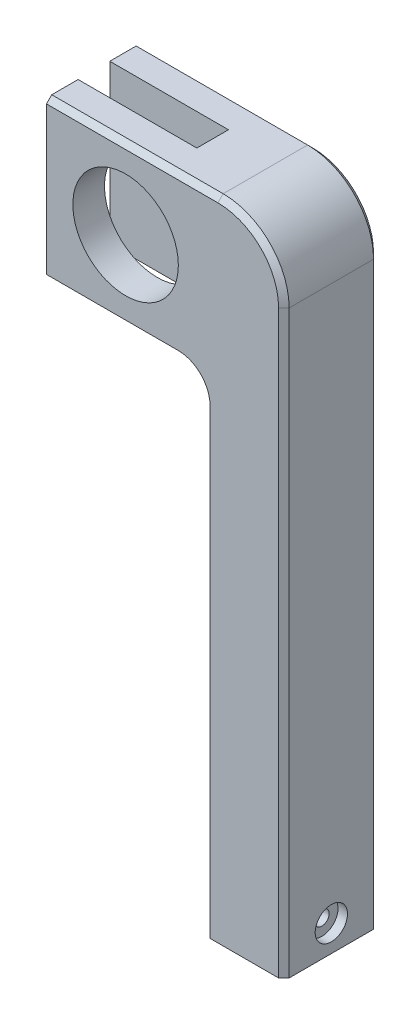
ISO-10303-21;
HEADER;
FILE_DESCRIPTION(('STEP AP214'),'2;1');
FILE_NAME('part.step','',(''),(''),'','','');
FILE_SCHEMA(('AUTOMOTIVE_DESIGN { 1 0 10303 214 1 1 1 1 }'));
ENDSEC;
DATA;
#1=APPLICATION_CONTEXT('core data for automotive mechanical design processes');
#2=APPLICATION_PROTOCOL_DEFINITION('international standard','automotive_design',2000,#1);
#3=PRODUCT_CONTEXT('',#1,'mechanical');
#4=PRODUCT('Part','Part','',(#3));
#5=PRODUCT_RELATED_PRODUCT_CATEGORY('part','',(#4));
#6=PRODUCT_DEFINITION_FORMATION('','',#4);
#7=PRODUCT_DEFINITION_CONTEXT('part definition',#1,'design');
#8=PRODUCT_DEFINITION('design','',#6,#7);
#9=PRODUCT_DEFINITION_SHAPE('','',#8);
#10=(LENGTH_UNIT() NAMED_UNIT(*) SI_UNIT(.MILLI.,.METRE.));
#11=(NAMED_UNIT(*) PLANE_ANGLE_UNIT() SI_UNIT($,.RADIAN.));
#12=(NAMED_UNIT(*) SI_UNIT($,.STERADIAN.) SOLID_ANGLE_UNIT());
#13=UNCERTAINTY_MEASURE_WITH_UNIT(LENGTH_MEASURE(1.E-05),#10,'distance_accuracy_value','');
#14=(GEOMETRIC_REPRESENTATION_CONTEXT(3) GLOBAL_UNCERTAINTY_ASSIGNED_CONTEXT((#13)) GLOBAL_UNIT_ASSIGNED_CONTEXT((#10,
#11,#12)) REPRESENTATION_CONTEXT('',''));
#15=CARTESIAN_POINT('',(0.,0.,0.));
#16=DIRECTION('',(0.,0.,1.));
#17=DIRECTION('',(1.,0.,0.));
#18=AXIS2_PLACEMENT_3D('',#15,#16,#17);
#19=CARTESIAN_POINT('',(-45.,-0.001000000000001,5.99999999999999));
#20=DIRECTION('',(0.,0.,1.));
#21=DIRECTION('',(1.,0.,0.));
#22=AXIS2_PLACEMENT_3D('',#19,#20,#21);
#23=PLANE('',#22);
#24=CARTESIAN_POINT('',(-60.,215.,5.99999999999999));
#25=DIRECTION('',(0.,0.,1.));
#26=DIRECTION('',(1.,0.,0.));
#27=AXIS2_PLACEMENT_3D('',#24,#25,#26);
#28=CIRCLE('',#27,20.);
#29=CARTESIAN_POINT('',(-45.,201.771243444677,5.99999999999999));
#30=VERTEX_POINT('',#29);
#31=CARTESIAN_POINT('',(-45.,228.228756555323,5.99999999999999));
#32=VERTEX_POINT('',#31);
#33=EDGE_CURVE('E257',#30,#32,#28,.F.);
#34=ORIENTED_EDGE('',*,*,#33,.F.);
#35=DIRECTION('',(0.,1.,0.));
#36=VECTOR('',#35,1.);
#37=CARTESIAN_POINT('',(-45.,-0.001000000000001,5.99999999999999));
#38=LINE('',#37,#36);
#39=CARTESIAN_POINT('',(-45.,185.,5.99999999999999));
#40=VERTEX_POINT('',#39);
#41=EDGE_CURVE('E283',#40,#30,#38,.T.);
#42=ORIENTED_EDGE('',*,*,#41,.F.);
#43=DIRECTION('',(1.,0.,0.));
#44=VECTOR('',#43,1.);
#45=CARTESIAN_POINT('',(-45.,185.,5.99999999999999));
#46=LINE('',#45,#44);
#47=CARTESIAN_POINT('',(-90.,185.,6.));
#48=VERTEX_POINT('',#47);
#49=EDGE_CURVE('E276',#48,#40,#46,.T.);
#50=ORIENTED_EDGE('',*,*,#49,.F.);
#51=DIRECTION('',(0.,1.,0.));
#52=VECTOR('',#51,1.);
#53=CARTESIAN_POINT('',(-90.,-0.001000000000001,6.));
#54=LINE('',#53,#52);
#55=CARTESIAN_POINT('',(-90.,245.,6.));
#56=VERTEX_POINT('',#55);
#57=EDGE_CURVE('E278',#48,#56,#54,.T.);
#58=ORIENTED_EDGE('',*,*,#57,.T.);
#59=DIRECTION('',(1.,0.,0.));
#60=VECTOR('',#59,1.);
#61=CARTESIAN_POINT('',(-45.,245.,5.99999999999999));
#62=LINE('',#61,#60);
#63=CARTESIAN_POINT('',(-45.,245.,5.99999999999999));
#64=VERTEX_POINT('',#63);
#65=EDGE_CURVE('E270',#56,#64,#62,.T.);
#66=ORIENTED_EDGE('',*,*,#65,.T.);
#67=EDGE_CURVE('E290',#32,#64,#38,.T.);
#68=ORIENTED_EDGE('',*,*,#67,.F.);
#69=EDGE_LOOP('',(#34,#42,#50,#58,#66,#68));
#70=FACE_BOUND('',#69,.T.);
#71=ADVANCED_FACE('F44',(#70),#23,.F.);
#72=CARTESIAN_POINT('',(-90.,185.,-18.));
#73=DIRECTION('',(-1.,0.,0.));
#74=DIRECTION('',(0.,0.,1.));
#75=AXIS2_PLACEMENT_3D('',#72,#73,#74);
#76=PLANE('',#75);
#77=CARTESIAN_POINT('',(-90.,190.,-12.));
#78=DIRECTION('',(-1.,0.,0.));
#79=DIRECTION('',(0.,0.,1.));
#80=AXIS2_PLACEMENT_3D('',#77,#78,#79);
#81=CIRCLE('',#80,1.5);
#82=CARTESIAN_POINT('',(-90.,190.,-10.5));
#83=VERTEX_POINT('',#82);
#84=EDGE_CURVE('E213',#83,#83,#81,.T.);
#85=ORIENTED_EDGE('',*,*,#84,.F.);
#86=EDGE_LOOP('',(#85));
#87=FACE_BOUND('',#86,.T.);
#88=CARTESIAN_POINT('',(-90.,240.,-12.));
#89=DIRECTION('',(-1.,0.,0.));
#90=DIRECTION('',(0.,0.,1.));
#91=AXIS2_PLACEMENT_3D('',#88,#89,#90);
#92=CIRCLE('',#91,1.5);
#93=CARTESIAN_POINT('',(-90.,240.,-10.5));
#94=VERTEX_POINT('',#93);
#95=EDGE_CURVE('E225',#94,#94,#92,.T.);
#96=ORIENTED_EDGE('',*,*,#95,.F.);
#97=EDGE_LOOP('',(#96));
#98=FACE_BOUND('',#97,.T.);
#99=DIRECTION('',(0.,-1.,0.));
#100=VECTOR('',#99,1.);
#101=CARTESIAN_POINT('',(-90.,185.,-18.));
#102=LINE('',#101,#100);
#103=CARTESIAN_POINT('',(-90.,243.,-18.));
#104=VERTEX_POINT('',#103);
#105=CARTESIAN_POINT('',(-90.,187.,-18.));
#106=VERTEX_POINT('',#105);
#107=EDGE_CURVE('E292',#104,#106,#102,.T.);
#108=ORIENTED_EDGE('',*,*,#107,.T.);
#109=DIRECTION('',(0.,0.707106781186543,-0.707106781186552));
#110=VECTOR('',#109,1.);
#111=CARTESIAN_POINT('',(-90.,186.,-17.));
#112=LINE('',#111,#110);
#113=CARTESIAN_POINT('',(-90.,185.,-16.));
#114=VERTEX_POINT('',#113);
#115=EDGE_CURVE('E378',#106,#114,#112,.F.);
#116=ORIENTED_EDGE('',*,*,#115,.T.);
#117=DIRECTION('',(0.,0.,1.));
#118=VECTOR('',#117,1.);
#119=CARTESIAN_POINT('',(-90.,185.,-18.));
#120=LINE('',#119,#118);
#121=CARTESIAN_POINT('',(-90.,185.,-6.));
#122=VERTEX_POINT('',#121);
#123=EDGE_CURVE('E311',#114,#122,#120,.T.);
#124=ORIENTED_EDGE('',*,*,#123,.T.);
#125=DIRECTION('',(0.,1.,0.));
#126=VECTOR('',#125,1.);
#127=CARTESIAN_POINT('',(-90.,-0.001000000000001,-6.));
#128=LINE('',#127,#126);
#129=CARTESIAN_POINT('',(-90.,245.,-6.));
#130=VERTEX_POINT('',#129);
#131=EDGE_CURVE('E279',#122,#130,#128,.T.);
#132=ORIENTED_EDGE('',*,*,#131,.T.);
#133=DIRECTION('',(0.,0.,1.));
#134=VECTOR('',#133,1.);
#135=CARTESIAN_POINT('',(-90.,245.,-18.));
#136=LINE('',#135,#134);
#137=CARTESIAN_POINT('',(-90.,245.,-16.));
#138=VERTEX_POINT('',#137);
#139=EDGE_CURVE('E313',#138,#130,#136,.T.);
#140=ORIENTED_EDGE('',*,*,#139,.F.);
#141=DIRECTION('',(0.,0.707106781186543,0.707106781186552));
#142=VECTOR('',#141,1.);
#143=CARTESIAN_POINT('',(-90.,214.,-47.));
#144=LINE('',#143,#142);
#145=EDGE_CURVE('E380',#138,#104,#144,.F.);
#146=ORIENTED_EDGE('',*,*,#145,.T.);
#147=EDGE_LOOP('',(#108,#116,#124,#132,#140,#146));
#148=FACE_BOUND('',#147,.T.);
#149=ADVANCED_FACE('F497',(#87,#98,#148),#76,.T.);
#150=CARTESIAN_POINT('',(-30.,185.,-18.));
#151=DIRECTION('',(0.,-1.,0.));
#152=DIRECTION('',(0.,0.,-1.));
#153=AXIS2_PLACEMENT_3D('',#150,#151,#152);
#154=PLANE('',#153);
#155=DIRECTION('',(0.,0.,1.));
#156=VECTOR('',#155,1.);
#157=CARTESIAN_POINT('',(-40.,185.,18.));
#158=LINE('',#157,#156);
#159=CARTESIAN_POINT('',(-40.,185.,-16.));
#160=VERTEX_POINT('',#159);
#161=CARTESIAN_POINT('',(-40.,185.,16.));
#162=VERTEX_POINT('',#161);
#163=EDGE_CURVE('E318',#160,#162,#158,.T.);
#164=ORIENTED_EDGE('',*,*,#163,.T.);
#165=DIRECTION('',(-1.,0.,0.));
#166=VECTOR('',#165,1.);
#167=CARTESIAN_POINT('',(-90.,185.,16.));
#168=LINE('',#167,#166);
#169=CARTESIAN_POINT('',(-90.,185.,16.));
#170=VERTEX_POINT('',#169);
#171=EDGE_CURVE('E342',#162,#170,#168,.T.);
#172=ORIENTED_EDGE('',*,*,#171,.T.);
#173=EDGE_CURVE('E312',#48,#170,#120,.T.);
#174=ORIENTED_EDGE('',*,*,#173,.F.);
#175=ORIENTED_EDGE('',*,*,#49,.T.);
#176=DIRECTION('',(0.,0.,-1.));
#177=VECTOR('',#176,1.);
#178=CARTESIAN_POINT('',(-45.,185.,5.99999999999999));
#179=LINE('',#178,#177);
#180=CARTESIAN_POINT('',(-45.,185.,-5.99999999999999));
#181=VERTEX_POINT('',#180);
#182=EDGE_CURVE('E262',#40,#181,#179,.T.);
#183=ORIENTED_EDGE('',*,*,#182,.T.);
#184=DIRECTION('',(-1.,0.,0.));
#185=VECTOR('',#184,1.);
#186=CARTESIAN_POINT('',(-45.,185.,-5.99999999999999));
#187=LINE('',#186,#185);
#188=EDGE_CURVE('E264',#181,#122,#187,.T.);
#189=ORIENTED_EDGE('',*,*,#188,.T.);
#190=ORIENTED_EDGE('',*,*,#123,.F.);
#191=DIRECTION('',(1.,0.,0.));
#192=VECTOR('',#191,1.);
#193=CARTESIAN_POINT('',(-30.,185.,-16.));
#194=LINE('',#193,#192);
#195=EDGE_CURVE('E338',#114,#160,#194,.T.);
#196=ORIENTED_EDGE('',*,*,#195,.T.);
#197=EDGE_LOOP('',(#164,#172,#174,#175,#183,#189,#190,#196));
#198=FACE_BOUND('',#197,.T.);
#199=ADVANCED_FACE('F473',(#198),#154,.T.);
#200=CARTESIAN_POINT('',(0.,245.,-18.));
#201=DIRECTION('',(1.,0.,0.));
#202=DIRECTION('',(0.,1.,0.));
#203=AXIS2_PLACEMENT_3D('',#200,#201,#202);
#204=PLANE('',#203);
#205=CARTESIAN_POINT('',(0.,10.,0.));
#206=DIRECTION('',(1.,0.,0.));
#207=DIRECTION('',(0.,0.,-1.));
#208=AXIS2_PLACEMENT_3D('',#205,#206,#207);
#209=CIRCLE('',#208,6.12);
#210=CARTESIAN_POINT('',(0.,10.,-6.12));
#211=VERTEX_POINT('',#210);
#212=EDGE_CURVE('E234',#211,#211,#209,.T.);
#213=ORIENTED_EDGE('',*,*,#212,.F.);
#214=EDGE_LOOP('',(#213));
#215=FACE_BOUND('',#214,.T.);
#216=DIRECTION('',(0.,0.,1.));
#217=VECTOR('',#216,1.);
#218=CARTESIAN_POINT('',(0.,0.,-18.));
#219=LINE('',#218,#217);
#220=CARTESIAN_POINT('',(0.,0.,-16.));
#221=VERTEX_POINT('',#220);
#222=CARTESIAN_POINT('',(0.,0.,16.));
#223=VERTEX_POINT('',#222);
#224=EDGE_CURVE('E302',#221,#223,#219,.T.);
#225=ORIENTED_EDGE('',*,*,#224,.F.);
#226=DIRECTION('',(0.,1.,0.));
#227=VECTOR('',#226,1.);
#228=CARTESIAN_POINT('',(0.,245.,-16.));
#229=LINE('',#228,#227);
#230=CARTESIAN_POINT('',(0.,220.,-16.));
#231=VERTEX_POINT('',#230);
#232=EDGE_CURVE('E11',#221,#231,#229,.T.);
#233=ORIENTED_EDGE('',*,*,#232,.T.);
#234=DIRECTION('',(0.,0.,1.));
#235=VECTOR('',#234,1.);
#236=CARTESIAN_POINT('',(0.,220.,-18.));
#237=LINE('',#236,#235);
#238=CARTESIAN_POINT('',(0.,220.,16.));
#239=VERTEX_POINT('',#238);
#240=EDGE_CURVE('E310',#231,#239,#237,.T.);
#241=ORIENTED_EDGE('',*,*,#240,.T.);
#242=DIRECTION('',(0.,-1.,0.));
#243=VECTOR('',#242,1.);
#244=CARTESIAN_POINT('',(0.,0.,16.));
#245=LINE('',#244,#243);
#246=EDGE_CURVE('E54',#239,#223,#245,.T.);
#247=ORIENTED_EDGE('',*,*,#246,.T.);
#248=EDGE_LOOP('',(#225,#233,#241,#247));
#249=FACE_BOUND('',#248,.T.);
#250=ADVANCED_FACE('F418',(#215,#249),#204,.T.);
#251=CARTESIAN_POINT('',(0.,0.,-18.));
#252=DIRECTION('',(0.,-1.,0.));
#253=DIRECTION('',(1.,0.,0.));
#254=AXIS2_PLACEMENT_3D('',#251,#252,#253);
#255=PLANE('',#254);
#256=DIRECTION('',(1.,0.,0.));
#257=VECTOR('',#256,1.);
#258=CARTESIAN_POINT('',(0.,0.,18.));
#259=LINE('',#258,#257);
#260=CARTESIAN_POINT('',(-28.,0.,18.));
#261=VERTEX_POINT('',#260);
#262=CARTESIAN_POINT('',(-2.,0.,18.));
#263=VERTEX_POINT('',#262);
#264=EDGE_CURVE('E298',#261,#263,#259,.T.);
#265=ORIENTED_EDGE('',*,*,#264,.F.);
#266=DIRECTION('',(-0.707106781186548,0.,-0.707106781186548));
#267=VECTOR('',#266,1.);
#268=CARTESIAN_POINT('',(-32.,0.,14.));
#269=LINE('',#268,#267);
#270=CARTESIAN_POINT('',(-30.,0.,16.));
#271=VERTEX_POINT('',#270);
#272=EDGE_CURVE('E360',#261,#271,#269,.T.);
#273=ORIENTED_EDGE('',*,*,#272,.T.);
#274=DIRECTION('',(0.,0.,1.));
#275=VECTOR('',#274,1.);
#276=CARTESIAN_POINT('',(-30.,0.,-18.));
#277=LINE('',#276,#275);
#278=CARTESIAN_POINT('',(-30.,0.,-16.));
#279=VERTEX_POINT('',#278);
#280=EDGE_CURVE('E308',#279,#271,#277,.T.);
#281=ORIENTED_EDGE('',*,*,#280,.F.);
#282=DIRECTION('',(-0.707106781186543,0.,0.707106781186552));
#283=VECTOR('',#282,1.);
#284=CARTESIAN_POINT('',(-14.0000000000002,0.,-32.));
#285=LINE('',#284,#283);
#286=CARTESIAN_POINT('',(-28.,0.,-18.));
#287=VERTEX_POINT('',#286);
#288=EDGE_CURVE('E357',#279,#287,#285,.F.);
#289=ORIENTED_EDGE('',*,*,#288,.T.);
#290=DIRECTION('',(1.,0.,0.));
#291=VECTOR('',#290,1.);
#292=CARTESIAN_POINT('',(0.,0.,-18.));
#293=LINE('',#292,#291);
#294=CARTESIAN_POINT('',(-1.99999999999997,0.,-18.));
#295=VERTEX_POINT('',#294);
#296=EDGE_CURVE('E294',#287,#295,#293,.T.);
#297=ORIENTED_EDGE('',*,*,#296,.T.);
#298=DIRECTION('',(-0.707106781186543,0.,-0.707106781186552));
#299=VECTOR('',#298,1.);
#300=CARTESIAN_POINT('',(-1.,0.,-17.));
#301=LINE('',#300,#299);
#302=EDGE_CURVE('E354',#295,#221,#301,.F.);
#303=ORIENTED_EDGE('',*,*,#302,.T.);
#304=ORIENTED_EDGE('',*,*,#224,.T.);
#305=DIRECTION('',(-0.707106781186552,0.,0.707106781186543));
#306=VECTOR('',#305,1.);
#307=CARTESIAN_POINT('',(17.,0.,-0.999999999999755));
#308=LINE('',#307,#306);
#309=EDGE_CURVE('E353',#223,#263,#308,.T.);
#310=ORIENTED_EDGE('',*,*,#309,.T.);
#311=EDGE_LOOP('',(#265,#273,#281,#289,#297,#303,#304,#310));
#312=FACE_BOUND('',#311,.T.);
#313=ADVANCED_FACE('F423',(#312),#255,.T.);
#314=CARTESIAN_POINT('',(-30.,185.,-18.));
#315=DIRECTION('',(-1.,0.,0.));
#316=DIRECTION('',(0.,-1.,0.));
#317=AXIS2_PLACEMENT_3D('',#314,#315,#316);
#318=PLANE('',#317);
#319=CARTESIAN_POINT('',(-30.,10.,0.));
#320=DIRECTION('',(-1.,0.,0.));
#321=DIRECTION('',(0.,-1.,0.));
#322=AXIS2_PLACEMENT_3D('',#319,#320,#321);
#323=CIRCLE('',#322,2.75);
#324=CARTESIAN_POINT('',(-30.,7.25,0.));
#325=VERTEX_POINT('',#324);
#326=EDGE_CURVE('E243',#325,#325,#323,.T.);
#327=ORIENTED_EDGE('',*,*,#326,.F.);
#328=EDGE_LOOP('',(#327));
#329=FACE_BOUND('',#328,.T.);
#330=ORIENTED_EDGE('',*,*,#280,.T.);
#331=DIRECTION('',(0.,1.,0.));
#332=VECTOR('',#331,1.);
#333=CARTESIAN_POINT('',(-30.,175.,16.));
#334=LINE('',#333,#332);
#335=CARTESIAN_POINT('',(-30.,175.,16.));
#336=VERTEX_POINT('',#335);
#337=EDGE_CURVE('E361',#271,#336,#334,.T.);
#338=ORIENTED_EDGE('',*,*,#337,.T.);
#339=DIRECTION('',(0.,0.,1.));
#340=VECTOR('',#339,1.);
#341=CARTESIAN_POINT('',(-30.,175.,-18.));
#342=LINE('',#341,#340);
#343=CARTESIAN_POINT('',(-30.,175.,-16.));
#344=VERTEX_POINT('',#343);
#345=EDGE_CURVE('E322',#336,#344,#342,.F.);
#346=ORIENTED_EDGE('',*,*,#345,.T.);
#347=DIRECTION('',(0.,-1.,0.));
#348=VECTOR('',#347,1.);
#349=CARTESIAN_POINT('',(-30.,185.,-16.));
#350=LINE('',#349,#348);
#351=EDGE_CURVE('E363',#344,#279,#350,.T.);
#352=ORIENTED_EDGE('',*,*,#351,.T.);
#353=EDGE_LOOP('',(#330,#338,#346,#352));
#354=FACE_BOUND('',#353,.T.);
#355=ADVANCED_FACE('F488',(#329,#354),#318,.T.);
#356=CARTESIAN_POINT('',(-90.,240.,12.));
#357=DIRECTION('',(-1.,0.,0.));
#358=DIRECTION('',(0.,0.,1.));
#359=AXIS2_PLACEMENT_3D('',#356,#357,#358);
#360=CIRCLE('',#359,1.5);
#361=CARTESIAN_POINT('',(-90.,240.,13.5));
#362=VERTEX_POINT('',#361);
#363=EDGE_CURVE('E214',#362,#362,#360,.T.);
#364=ORIENTED_EDGE('',*,*,#363,.F.);
#365=EDGE_LOOP('',(#364));
#366=FACE_BOUND('',#365,.T.);
#367=CARTESIAN_POINT('',(-90.,190.,12.));
#368=DIRECTION('',(-1.,0.,0.));
#369=DIRECTION('',(0.,0.,1.));
#370=AXIS2_PLACEMENT_3D('',#367,#368,#369);
#371=CIRCLE('',#370,1.5);
#372=CARTESIAN_POINT('',(-90.,190.,13.5));
#373=VERTEX_POINT('',#372);
#374=EDGE_CURVE('E226',#373,#373,#371,.T.);
#375=ORIENTED_EDGE('',*,*,#374,.F.);
#376=EDGE_LOOP('',(#375));
#377=FACE_BOUND('',#376,.T.);
#378=ORIENTED_EDGE('',*,*,#173,.T.);
#379=DIRECTION('',(0.,0.707106781186548,0.707106781186548));
#380=VECTOR('',#379,1.);
#381=CARTESIAN_POINT('',(-90.,168.,-1.00000000000001));
#382=LINE('',#381,#380);
#383=CARTESIAN_POINT('',(-90.,187.,18.));
#384=VERTEX_POINT('',#383);
#385=EDGE_CURVE('E350',#170,#384,#382,.T.);
#386=ORIENTED_EDGE('',*,*,#385,.T.);
#387=DIRECTION('',(0.,-1.,0.));
#388=VECTOR('',#387,1.);
#389=CARTESIAN_POINT('',(-90.,185.,18.));
#390=LINE('',#389,#388);
#391=CARTESIAN_POINT('',(-90.,243.,18.));
#392=VERTEX_POINT('',#391);
#393=EDGE_CURVE('E293',#392,#384,#390,.T.);
#394=ORIENTED_EDGE('',*,*,#393,.F.);
#395=DIRECTION('',(0.,0.707106781186552,-0.707106781186543));
#396=VECTOR('',#395,1.);
#397=CARTESIAN_POINT('',(-90.,232.,29.0000000000002));
#398=LINE('',#397,#396);
#399=CARTESIAN_POINT('',(-90.,245.,16.));
#400=VERTEX_POINT('',#399);
#401=EDGE_CURVE('E341',#392,#400,#398,.T.);
#402=ORIENTED_EDGE('',*,*,#401,.T.);
#403=EDGE_CURVE('E299',#56,#400,#136,.T.);
#404=ORIENTED_EDGE('',*,*,#403,.F.);
#405=ORIENTED_EDGE('',*,*,#57,.F.);
#406=EDGE_LOOP('',(#378,#386,#394,#402,#404,#405));
#407=FACE_BOUND('',#406,.T.);
#408=ADVANCED_FACE('F449',(#366,#377,#407),#76,.T.);
#409=CARTESIAN_POINT('',(-90.,245.,-18.));
#410=DIRECTION('',(0.,1.,0.));
#411=DIRECTION('',(0.,0.,1.));
#412=AXIS2_PLACEMENT_3D('',#409,#410,#411);
#413=PLANE('',#412);
#414=DIRECTION('',(0.,0.,1.));
#415=VECTOR('',#414,1.);
#416=CARTESIAN_POINT('',(-25.,245.,-18.));
#417=LINE('',#416,#415);
#418=CARTESIAN_POINT('',(-25.,245.,16.));
#419=VERTEX_POINT('',#418);
#420=CARTESIAN_POINT('',(-25.,245.,-16.));
#421=VERTEX_POINT('',#420);
#422=EDGE_CURVE('E320',#419,#421,#417,.F.);
#423=ORIENTED_EDGE('',*,*,#422,.T.);
#424=DIRECTION('',(-1.,0.,0.));
#425=VECTOR('',#424,1.);
#426=CARTESIAN_POINT('',(-90.,245.,-16.));
#427=LINE('',#426,#425);
#428=EDGE_CURVE('E384',#421,#138,#427,.T.);
#429=ORIENTED_EDGE('',*,*,#428,.T.);
#430=ORIENTED_EDGE('',*,*,#139,.T.);
#431=DIRECTION('',(-1.,0.,0.));
#432=VECTOR('',#431,1.);
#433=CARTESIAN_POINT('',(-45.,245.,-5.99999999999999));
#434=LINE('',#433,#432);
#435=CARTESIAN_POINT('',(-45.,245.,-5.99999999999999));
#436=VERTEX_POINT('',#435);
#437=EDGE_CURVE('E271',#436,#130,#434,.T.);
#438=ORIENTED_EDGE('',*,*,#437,.F.);
#439=DIRECTION('',(0.,0.,-1.));
#440=VECTOR('',#439,1.);
#441=CARTESIAN_POINT('',(-45.,245.,5.99999999999999));
#442=LINE('',#441,#440);
#443=EDGE_CURVE('E269',#64,#436,#442,.T.);
#444=ORIENTED_EDGE('',*,*,#443,.F.);
#445=ORIENTED_EDGE('',*,*,#65,.F.);
#446=ORIENTED_EDGE('',*,*,#403,.T.);
#447=DIRECTION('',(1.,0.,0.));
#448=VECTOR('',#447,1.);
#449=CARTESIAN_POINT('',(-25.,245.,16.));
#450=LINE('',#449,#448);
#451=EDGE_CURVE('E382',#400,#419,#450,.T.);
#452=ORIENTED_EDGE('',*,*,#451,.T.);
#453=EDGE_LOOP('',(#423,#429,#430,#438,#444,#445,#446,#452));
#454=FACE_BOUND('',#453,.T.);
#455=ADVANCED_FACE('F436',(#454),#413,.T.);
#456=CARTESIAN_POINT('',(0.,0.,-18.));
#457=DIRECTION('',(0.,0.,-1.));
#458=DIRECTION('',(-1.,0.,0.));
#459=AXIS2_PLACEMENT_3D('',#456,#457,#458);
#460=PLANE('',#459);
#461=CARTESIAN_POINT('',(-60.,215.,-18.));
#462=DIRECTION('',(0.,0.,-1.));
#463=DIRECTION('',(-1.,0.,0.));
#464=AXIS2_PLACEMENT_3D('',#461,#462,#463);
#465=CIRCLE('',#464,13.);
#466=CARTESIAN_POINT('',(-73.,215.,-18.));
#467=VERTEX_POINT('',#466);
#468=EDGE_CURVE('E250',#467,#467,#465,.T.);
#469=ORIENTED_EDGE('',*,*,#468,.F.);
#470=EDGE_LOOP('',(#469));
#471=FACE_BOUND('',#470,.T.);
#472=CARTESIAN_POINT('',(-40.,175.,-18.));
#473=DIRECTION('',(0.,0.,-1.));
#474=DIRECTION('',(-1.,0.,0.));
#475=AXIS2_PLACEMENT_3D('',#472,#473,#474);
#476=CIRCLE('',#475,12.);
#477=CARTESIAN_POINT('',(-28.,175.,-18.));
#478=VERTEX_POINT('',#477);
#479=CARTESIAN_POINT('',(-40.,187.,-18.));
#480=VERTEX_POINT('',#479);
#481=EDGE_CURVE('E373',#478,#480,#476,.F.);
#482=ORIENTED_EDGE('',*,*,#481,.T.);
#483=DIRECTION('',(-1.,0.,0.));
#484=VECTOR('',#483,1.);
#485=CARTESIAN_POINT('',(0.,187.,-18.));
#486=LINE('',#485,#484);
#487=EDGE_CURVE('E374',#480,#106,#486,.T.);
#488=ORIENTED_EDGE('',*,*,#487,.T.);
#489=ORIENTED_EDGE('',*,*,#107,.F.);
#490=DIRECTION('',(1.,0.,0.));
#491=VECTOR('',#490,1.);
#492=CARTESIAN_POINT('',(0.,243.,-18.));
#493=LINE('',#492,#491);
#494=CARTESIAN_POINT('',(-25.,243.,-18.));
#495=VERTEX_POINT('',#494);
#496=EDGE_CURVE('E367',#104,#495,#493,.T.);
#497=ORIENTED_EDGE('',*,*,#496,.T.);
#498=CARTESIAN_POINT('',(-25.,220.,-18.));
#499=DIRECTION('',(0.,0.,-1.));
#500=DIRECTION('',(-1.,0.,0.));
#501=AXIS2_PLACEMENT_3D('',#498,#499,#500);
#502=CIRCLE('',#501,23.);
#503=CARTESIAN_POINT('',(-1.99999999999998,220.,-18.));
#504=VERTEX_POINT('',#503);
#505=EDGE_CURVE('E370',#495,#504,#502,.T.);
#506=ORIENTED_EDGE('',*,*,#505,.T.);
#507=DIRECTION('',(0.,-1.,0.));
#508=VECTOR('',#507,1.);
#509=CARTESIAN_POINT('',(-1.99999999999997,0.,-18.));
#510=LINE('',#509,#508);
#511=EDGE_CURVE('E362',#504,#295,#510,.T.);
#512=ORIENTED_EDGE('',*,*,#511,.T.);
#513=ORIENTED_EDGE('',*,*,#296,.F.);
#514=DIRECTION('',(0.,1.,0.));
#515=VECTOR('',#514,1.);
#516=CARTESIAN_POINT('',(-28.,0.,-18.));
#517=LINE('',#516,#515);
#518=EDGE_CURVE('E371',#287,#478,#517,.T.);
#519=ORIENTED_EDGE('',*,*,#518,.T.);
#520=EDGE_LOOP('',(#482,#488,#489,#497,#506,#512,#513,#519));
#521=FACE_BOUND('',#520,.T.);
#522=ADVANCED_FACE('F491',(#471,#521),#460,.T.);
#523=CARTESIAN_POINT('',(0.,0.,18.));
#524=DIRECTION('',(0.,0.,-1.));
#525=DIRECTION('',(-1.,0.,0.));
#526=AXIS2_PLACEMENT_3D('',#523,#524,#525);
#527=PLANE('',#526);
#528=CARTESIAN_POINT('',(-60.,215.,18.));
#529=DIRECTION('',(0.,0.,1.));
#530=DIRECTION('',(1.,0.,0.));
#531=AXIS2_PLACEMENT_3D('',#528,#529,#530);
#532=CIRCLE('',#531,20.);
#533=CARTESIAN_POINT('',(-40.,215.,18.));
#534=VERTEX_POINT('',#533);
#535=EDGE_CURVE('E251',#534,#534,#532,.T.);
#536=ORIENTED_EDGE('',*,*,#535,.F.);
#537=EDGE_LOOP('',(#536));
#538=FACE_BOUND('',#537,.T.);
#539=ORIENTED_EDGE('',*,*,#393,.T.);
#540=DIRECTION('',(1.,0.,0.));
#541=VECTOR('',#540,1.);
#542=CARTESIAN_POINT('',(-40.,187.,18.));
#543=LINE('',#542,#541);
#544=CARTESIAN_POINT('',(-40.,187.,18.));
#545=VERTEX_POINT('',#544);
#546=EDGE_CURVE('E340',#384,#545,#543,.T.);
#547=ORIENTED_EDGE('',*,*,#546,.T.);
#548=CARTESIAN_POINT('',(-40.,175.,18.));
#549=DIRECTION('',(0.,0.,-1.));
#550=DIRECTION('',(-1.,0.,0.));
#551=AXIS2_PLACEMENT_3D('',#548,#549,#550);
#552=CIRCLE('',#551,12.);
#553=CARTESIAN_POINT('',(-28.,175.,18.));
#554=VERTEX_POINT('',#553);
#555=EDGE_CURVE('E334',#545,#554,#552,.T.);
#556=ORIENTED_EDGE('',*,*,#555,.T.);
#557=DIRECTION('',(0.,-1.,0.));
#558=VECTOR('',#557,1.);
#559=CARTESIAN_POINT('',(-28.,0.,18.));
#560=LINE('',#559,#558);
#561=EDGE_CURVE('E333',#554,#261,#560,.T.);
#562=ORIENTED_EDGE('',*,*,#561,.T.);
#563=ORIENTED_EDGE('',*,*,#264,.T.);
#564=DIRECTION('',(0.,1.,0.));
#565=VECTOR('',#564,1.);
#566=CARTESIAN_POINT('',(-2.,220.,18.));
#567=LINE('',#566,#565);
#568=CARTESIAN_POINT('',(-2.,220.,18.));
#569=VERTEX_POINT('',#568);
#570=EDGE_CURVE('E327',#263,#569,#567,.T.);
#571=ORIENTED_EDGE('',*,*,#570,.T.);
#572=CARTESIAN_POINT('',(-25.,220.,18.));
#573=DIRECTION('',(0.,0.,-1.));
#574=DIRECTION('',(-1.,0.,0.));
#575=AXIS2_PLACEMENT_3D('',#572,#573,#574);
#576=CIRCLE('',#575,23.);
#577=CARTESIAN_POINT('',(-25.,243.,18.));
#578=VERTEX_POINT('',#577);
#579=EDGE_CURVE('E328',#569,#578,#576,.F.);
#580=ORIENTED_EDGE('',*,*,#579,.T.);
#581=DIRECTION('',(-1.,0.,0.));
#582=VECTOR('',#581,1.);
#583=CARTESIAN_POINT('',(-90.,243.,18.));
#584=LINE('',#583,#582);
#585=EDGE_CURVE('E326',#578,#392,#584,.T.);
#586=ORIENTED_EDGE('',*,*,#585,.T.);
#587=EDGE_LOOP('',(#539,#547,#556,#562,#563,#571,#580,#586));
#588=FACE_BOUND('',#587,.T.);
#589=ADVANCED_FACE('F444',(#538,#588),#527,.F.);
#590=CARTESIAN_POINT('',(-45.,-0.001000000000001,-5.99999999999999));
#591=DIRECTION('',(0.,0.,-1.));
#592=DIRECTION('',(-1.,0.,0.));
#593=AXIS2_PLACEMENT_3D('',#590,#591,#592);
#594=PLANE('',#593);
#595=CARTESIAN_POINT('',(-60.,215.,-6.));
#596=DIRECTION('',(0.,0.,-1.));
#597=DIRECTION('',(-1.,0.,0.));
#598=AXIS2_PLACEMENT_3D('',#595,#596,#597);
#599=CIRCLE('',#598,13.);
#600=CARTESIAN_POINT('',(-73.,215.,-6.));
#601=VERTEX_POINT('',#600);
#602=EDGE_CURVE('E249',#601,#601,#599,.F.);
#603=ORIENTED_EDGE('',*,*,#602,.F.);
#604=EDGE_LOOP('',(#603));
#605=FACE_BOUND('',#604,.T.);
#606=DIRECTION('',(0.,1.,0.));
#607=VECTOR('',#606,1.);
#608=CARTESIAN_POINT('',(-45.,-0.001000000000001,-5.99999999999999));
#609=LINE('',#608,#607);
#610=EDGE_CURVE('E282',#181,#436,#609,.T.);
#611=ORIENTED_EDGE('',*,*,#610,.T.);
#612=ORIENTED_EDGE('',*,*,#437,.T.);
#613=ORIENTED_EDGE('',*,*,#131,.F.);
#614=ORIENTED_EDGE('',*,*,#188,.F.);
#615=EDGE_LOOP('',(#611,#612,#613,#614));
#616=FACE_BOUND('',#615,.T.);
#617=ADVANCED_FACE('F502',(#605,#616),#594,.F.);
#618=CARTESIAN_POINT('',(-45.,-0.001000000000001,5.99999999999999));
#619=DIRECTION('',(1.,0.,0.));
#620=DIRECTION('',(0.,0.,-1.));
#621=AXIS2_PLACEMENT_3D('',#618,#619,#620);
#622=PLANE('',#621);
#623=ORIENTED_EDGE('',*,*,#41,.T.);
#624=EDGE_CURVE('E286',#30,#32,#38,.T.);
#625=ORIENTED_EDGE('',*,*,#624,.T.);
#626=ORIENTED_EDGE('',*,*,#67,.T.);
#627=ORIENTED_EDGE('',*,*,#443,.T.);
#628=ORIENTED_EDGE('',*,*,#610,.F.);
#629=ORIENTED_EDGE('',*,*,#182,.F.);
#630=EDGE_LOOP('',(#623,#625,#626,#627,#628,#629));
#631=FACE_BOUND('',#630,.T.);
#632=ADVANCED_FACE('F510',(#631),#622,.F.);
#633=CARTESIAN_POINT('',(-25.,220.,-18.));
#634=DIRECTION('',(0.,0.,1.));
#635=DIRECTION('',(1.,0.,0.));
#636=AXIS2_PLACEMENT_3D('',#633,#634,#635);
#637=CYLINDRICAL_SURFACE('',#636,25.);
#638=ORIENTED_EDGE('',*,*,#240,.F.);
#639=CARTESIAN_POINT('',(-25.,220.,-16.));
#640=DIRECTION('',(0.,0.,-1.));
#641=DIRECTION('',(-1.,0.,0.));
#642=AXIS2_PLACEMENT_3D('',#639,#640,#641);
#643=CIRCLE('',#642,25.);
#644=EDGE_CURVE('E389',#231,#421,#643,.F.);
#645=ORIENTED_EDGE('',*,*,#644,.T.);
#646=ORIENTED_EDGE('',*,*,#422,.F.);
#647=CARTESIAN_POINT('',(-25.,220.,16.));
#648=DIRECTION('',(0.,0.,-1.));
#649=DIRECTION('',(-1.,0.,0.));
#650=AXIS2_PLACEMENT_3D('',#647,#648,#649);
#651=CIRCLE('',#650,25.);
#652=EDGE_CURVE('E62',#419,#239,#651,.T.);
#653=ORIENTED_EDGE('',*,*,#652,.T.);
#654=EDGE_LOOP('',(#638,#645,#646,#653));
#655=FACE_BOUND('',#654,.T.);
#656=ADVANCED_FACE('F432',(#655),#637,.T.);
#657=CARTESIAN_POINT('',(-40.,175.,-18.));
#658=DIRECTION('',(0.,0.,-1.));
#659=DIRECTION('',(-1.,0.,0.));
#660=AXIS2_PLACEMENT_3D('',#657,#658,#659);
#661=CYLINDRICAL_SURFACE('',#660,10.);
#662=ORIENTED_EDGE('',*,*,#345,.F.);
#663=CARTESIAN_POINT('',(-40.,175.,16.));
#664=DIRECTION('',(0.,0.,-1.));
#665=DIRECTION('',(-1.,0.,0.));
#666=AXIS2_PLACEMENT_3D('',#663,#664,#665);
#667=CIRCLE('',#666,10.);
#668=EDGE_CURVE('E351',#336,#162,#667,.F.);
#669=ORIENTED_EDGE('',*,*,#668,.T.);
#670=ORIENTED_EDGE('',*,*,#163,.F.);
#671=CARTESIAN_POINT('',(-40.,175.,-16.));
#672=DIRECTION('',(0.,0.,-1.));
#673=DIRECTION('',(-1.,0.,0.));
#674=AXIS2_PLACEMENT_3D('',#671,#672,#673);
#675=CIRCLE('',#674,10.);
#676=EDGE_CURVE('E349',#160,#344,#675,.T.);
#677=ORIENTED_EDGE('',*,*,#676,.T.);
#678=EDGE_LOOP('',(#662,#669,#670,#677));
#679=FACE_BOUND('',#678,.T.);
#680=ADVANCED_FACE('F469',(#679),#661,.F.);
#681=CARTESIAN_POINT('',(-60.,215.,-50.5685424949238));
#682=DIRECTION('',(0.,0.,1.));
#683=DIRECTION('',(1.,0.,0.));
#684=AXIS2_PLACEMENT_3D('',#681,#682,#683);
#685=CYLINDRICAL_SURFACE('',#684,20.);
#686=ORIENTED_EDGE('',*,*,#33,.T.);
#687=EDGE_CURVE('E259',#32,#30,#28,.F.);
#688=ORIENTED_EDGE('',*,*,#687,.T.);
#689=EDGE_LOOP('',(#686,#688));
#690=FACE_BOUND('',#689,.T.);
#691=ORIENTED_EDGE('',*,*,#535,.T.);
#692=EDGE_LOOP('',(#691));
#693=FACE_BOUND('',#692,.T.);
#694=ADVANCED_FACE('F519',(#690,#693),#685,.F.);
#695=CARTESIAN_POINT('',(-45.,-0.001000000000001,5.99999999999999));
#696=DIRECTION('',(0.,0.,1.));
#697=DIRECTION('',(1.,0.,0.));
#698=AXIS2_PLACEMENT_3D('',#695,#696,#697);
#699=PLANE('',#698);
#700=ORIENTED_EDGE('',*,*,#687,.F.);
#701=ORIENTED_EDGE('',*,*,#624,.F.);
#702=EDGE_LOOP('',(#700,#701));
#703=FACE_BOUND('',#702,.T.);
#704=ADVANCED_FACE('F513',(#703),#699,.T.);
#705=CARTESIAN_POINT('',(-60.,215.,18.001));
#706=DIRECTION('',(0.,0.,-1.));
#707=DIRECTION('',(-1.,0.,0.));
#708=AXIS2_PLACEMENT_3D('',#705,#706,#707);
#709=CYLINDRICAL_SURFACE('',#708,13.);
#710=ORIENTED_EDGE('',*,*,#468,.T.);
#711=EDGE_LOOP('',(#710));
#712=FACE_BOUND('',#711,.T.);
#713=ORIENTED_EDGE('',*,*,#602,.T.);
#714=EDGE_LOOP('',(#713));
#715=FACE_BOUND('',#714,.T.);
#716=ADVANCED_FACE('F550',(#712,#715),#709,.F.);
#717=CARTESIAN_POINT('',(-28.,0.,18.));
#718=DIRECTION('',(-0.707106781186547,0.,0.707106781186547));
#719=DIRECTION('',(0.,1.,0.));
#720=AXIS2_PLACEMENT_3D('',#717,#718,#719);
#721=PLANE('',#720);
#722=ORIENTED_EDGE('',*,*,#272,.F.);
#723=ORIENTED_EDGE('',*,*,#561,.F.);
#724=DIRECTION('',(0.707106781186547,0.,0.707106781186547));
#725=VECTOR('',#724,1.);
#726=CARTESIAN_POINT('',(-30.,175.,16.));
#727=LINE('',#726,#725);
#728=EDGE_CURVE('E252',#336,#554,#727,.T.);
#729=ORIENTED_EDGE('',*,*,#728,.F.);
#730=ORIENTED_EDGE('',*,*,#337,.F.);
#731=EDGE_LOOP('',(#722,#723,#729,#730));
#732=FACE_BOUND('',#731,.T.);
#733=ADVANCED_FACE('F465',(#732),#721,.T.);
#734=CARTESIAN_POINT('',(-40.,175.,18.));
#735=DIRECTION('',(0.,0.,1.));
#736=DIRECTION('',(1.,0.,0.));
#737=AXIS2_PLACEMENT_3D('',#734,#735,#736);
#738=CONICAL_SURFACE('',#737,12.,0.78539816339745);
#739=ORIENTED_EDGE('',*,*,#728,.T.);
#740=ORIENTED_EDGE('',*,*,#555,.F.);
#741=DIRECTION('',(0.,0.707106781186547,0.707106781186547));
#742=VECTOR('',#741,1.);
#743=CARTESIAN_POINT('',(-40.,185.,16.));
#744=LINE('',#743,#742);
#745=EDGE_CURVE('E386',#162,#545,#744,.T.);
#746=ORIENTED_EDGE('',*,*,#745,.F.);
#747=ORIENTED_EDGE('',*,*,#668,.F.);
#748=EDGE_LOOP('',(#739,#740,#746,#747));
#749=FACE_BOUND('',#748,.T.);
#750=ADVANCED_FACE('F464',(#749),#738,.F.);
#751=CARTESIAN_POINT('',(0.,187.,18.));
#752=DIRECTION('',(0.,-0.707106781186547,0.707106781186547));
#753=DIRECTION('',(-1.,0.,0.));
#754=AXIS2_PLACEMENT_3D('',#751,#752,#753);
#755=PLANE('',#754);
#756=ORIENTED_EDGE('',*,*,#385,.F.);
#757=ORIENTED_EDGE('',*,*,#171,.F.);
#758=ORIENTED_EDGE('',*,*,#745,.T.);
#759=ORIENTED_EDGE('',*,*,#546,.F.);
#760=EDGE_LOOP('',(#756,#757,#758,#759));
#761=FACE_BOUND('',#760,.T.);
#762=ADVANCED_FACE('F455',(#761),#755,.T.);
#763=CARTESIAN_POINT('',(-30.,185.,-16.));
#764=DIRECTION('',(0.707106781186552,0.,0.707106781186543));
#765=DIRECTION('',(0.,-1.,0.));
#766=AXIS2_PLACEMENT_3D('',#763,#764,#765);
#767=PLANE('',#766);
#768=ORIENTED_EDGE('',*,*,#288,.F.);
#769=ORIENTED_EDGE('',*,*,#351,.F.);
#770=DIRECTION('',(-0.707106781186543,0.,0.707106781186552));
#771=VECTOR('',#770,1.);
#772=CARTESIAN_POINT('',(-28.,175.,-18.));
#773=LINE('',#772,#771);
#774=EDGE_CURVE('E395',#478,#344,#773,.T.);
#775=ORIENTED_EDGE('',*,*,#774,.F.);
#776=ORIENTED_EDGE('',*,*,#518,.F.);
#777=EDGE_LOOP('',(#768,#769,#775,#776));
#778=FACE_BOUND('',#777,.T.);
#779=ADVANCED_FACE('F489',(#778),#767,.F.);
#780=CARTESIAN_POINT('',(-40.,175.,-18.));
#781=DIRECTION('',(0.,0.,-1.));
#782=DIRECTION('',(-1.,0.,0.));
#783=AXIS2_PLACEMENT_3D('',#780,#781,#782);
#784=CONICAL_SURFACE('',#783,12.,0.785398163397444);
#785=ORIENTED_EDGE('',*,*,#774,.T.);
#786=ORIENTED_EDGE('',*,*,#676,.F.);
#787=DIRECTION('',(0.,-0.707106781186543,0.707106781186552));
#788=VECTOR('',#787,1.);
#789=CARTESIAN_POINT('',(-40.,187.,-18.));
#790=LINE('',#789,#788);
#791=EDGE_CURVE('E391',#480,#160,#790,.T.);
#792=ORIENTED_EDGE('',*,*,#791,.F.);
#793=ORIENTED_EDGE('',*,*,#481,.F.);
#794=EDGE_LOOP('',(#785,#786,#792,#793));
#795=FACE_BOUND('',#794,.T.);
#796=ADVANCED_FACE('F485',(#795),#784,.F.);
#797=CARTESIAN_POINT('',(-30.,185.,-16.));
#798=DIRECTION('',(0.,0.707106781186552,0.707106781186543));
#799=DIRECTION('',(1.,0.,0.));
#800=AXIS2_PLACEMENT_3D('',#797,#798,#799);
#801=PLANE('',#800);
#802=ORIENTED_EDGE('',*,*,#115,.F.);
#803=ORIENTED_EDGE('',*,*,#487,.F.);
#804=ORIENTED_EDGE('',*,*,#791,.T.);
#805=ORIENTED_EDGE('',*,*,#195,.F.);
#806=EDGE_LOOP('',(#802,#803,#804,#805));
#807=FACE_BOUND('',#806,.T.);
#808=ADVANCED_FACE('F477',(#807),#801,.F.);
#809=CARTESIAN_POINT('',(0.,245.,-16.));
#810=DIRECTION('',(-0.707106781186552,0.,0.707106781186543));
#811=DIRECTION('',(0.,1.,0.));
#812=AXIS2_PLACEMENT_3D('',#809,#810,#811);
#813=PLANE('',#812);
#814=ORIENTED_EDGE('',*,*,#302,.F.);
#815=ORIENTED_EDGE('',*,*,#511,.F.);
#816=DIRECTION('',(-0.707106781186543,0.,-0.707106781186552));
#817=VECTOR('',#816,1.);
#818=CARTESIAN_POINT('',(0.,220.,-16.));
#819=LINE('',#818,#817);
#820=EDGE_CURVE('E400',#231,#504,#819,.T.);
#821=ORIENTED_EDGE('',*,*,#820,.F.);
#822=ORIENTED_EDGE('',*,*,#232,.F.);
#823=EDGE_LOOP('',(#814,#815,#821,#822));
#824=FACE_BOUND('',#823,.T.);
#825=ADVANCED_FACE('F428',(#824),#813,.F.);
#826=CARTESIAN_POINT('',(-25.,220.,-18.));
#827=DIRECTION('',(0.,0.,1.));
#828=DIRECTION('',(1.,0.,0.));
#829=AXIS2_PLACEMENT_3D('',#826,#827,#828);
#830=CONICAL_SURFACE('',#829,23.,0.785398163397443);
#831=ORIENTED_EDGE('',*,*,#820,.T.);
#832=ORIENTED_EDGE('',*,*,#505,.F.);
#833=DIRECTION('',(0.,-0.707106781186543,-0.707106781186552));
#834=VECTOR('',#833,1.);
#835=CARTESIAN_POINT('',(-25.,245.,-16.));
#836=LINE('',#835,#834);
#837=EDGE_CURVE('E399',#421,#495,#836,.T.);
#838=ORIENTED_EDGE('',*,*,#837,.F.);
#839=ORIENTED_EDGE('',*,*,#644,.F.);
#840=EDGE_LOOP('',(#831,#832,#838,#839));
#841=FACE_BOUND('',#840,.T.);
#842=ADVANCED_FACE('F435',(#841),#830,.T.);
#843=CARTESIAN_POINT('',(-90.,245.,-16.));
#844=DIRECTION('',(0.,-0.707106781186552,0.707106781186543));
#845=DIRECTION('',(-1.,0.,0.));
#846=AXIS2_PLACEMENT_3D('',#843,#844,#845);
#847=PLANE('',#846);
#848=ORIENTED_EDGE('',*,*,#837,.T.);
#849=ORIENTED_EDGE('',*,*,#496,.F.);
#850=ORIENTED_EDGE('',*,*,#145,.F.);
#851=ORIENTED_EDGE('',*,*,#428,.F.);
#852=EDGE_LOOP('',(#848,#849,#850,#851));
#853=FACE_BOUND('',#852,.T.);
#854=ADVANCED_FACE('F500',(#853),#847,.F.);
#855=CARTESIAN_POINT('',(-2.,0.,18.));
#856=DIRECTION('',(0.707106781186543,0.,0.707106781186552));
#857=DIRECTION('',(0.,-1.,0.));
#858=AXIS2_PLACEMENT_3D('',#855,#856,#857);
#859=PLANE('',#858);
#860=ORIENTED_EDGE('',*,*,#309,.F.);
#861=ORIENTED_EDGE('',*,*,#246,.F.);
#862=DIRECTION('',(0.707106781186552,0.,-0.707106781186543));
#863=VECTOR('',#862,1.);
#864=CARTESIAN_POINT('',(-2.,220.,18.));
#865=LINE('',#864,#863);
#866=EDGE_CURVE('E49',#569,#239,#865,.T.);
#867=ORIENTED_EDGE('',*,*,#866,.F.);
#868=ORIENTED_EDGE('',*,*,#570,.F.);
#869=EDGE_LOOP('',(#860,#861,#867,#868));
#870=FACE_BOUND('',#869,.T.);
#871=ADVANCED_FACE('F48',(#870),#859,.T.);
#872=CARTESIAN_POINT('',(-25.,220.,18.));
#873=DIRECTION('',(0.,0.,-1.));
#874=DIRECTION('',(-1.,0.,0.));
#875=AXIS2_PLACEMENT_3D('',#872,#873,#874);
#876=CONICAL_SURFACE('',#875,23.,0.785398163397457);
#877=ORIENTED_EDGE('',*,*,#866,.T.);
#878=ORIENTED_EDGE('',*,*,#652,.F.);
#879=DIRECTION('',(0.,0.707106781186552,-0.707106781186543));
#880=VECTOR('',#879,1.);
#881=CARTESIAN_POINT('',(-25.,243.,18.));
#882=LINE('',#881,#880);
#883=EDGE_CURVE('E246',#578,#419,#882,.T.);
#884=ORIENTED_EDGE('',*,*,#883,.F.);
#885=ORIENTED_EDGE('',*,*,#579,.F.);
#886=EDGE_LOOP('',(#877,#878,#884,#885));
#887=FACE_BOUND('',#886,.T.);
#888=ADVANCED_FACE('F413',(#887),#876,.T.);
#889=CARTESIAN_POINT('',(0.,243.,18.));
#890=DIRECTION('',(0.,0.707106781186543,0.707106781186552));
#891=DIRECTION('',(1.,0.,0.));
#892=AXIS2_PLACEMENT_3D('',#889,#890,#891);
#893=PLANE('',#892);
#894=ORIENTED_EDGE('',*,*,#883,.T.);
#895=ORIENTED_EDGE('',*,*,#451,.F.);
#896=ORIENTED_EDGE('',*,*,#401,.F.);
#897=ORIENTED_EDGE('',*,*,#585,.F.);
#898=EDGE_LOOP('',(#894,#895,#896,#897));
#899=FACE_BOUND('',#898,.T.);
#900=ADVANCED_FACE('F441',(#899),#893,.T.);
#901=CARTESIAN_POINT('',(0.,10.,0.));
#902=DIRECTION('',(1.,0.,0.));
#903=DIRECTION('',(0.,0.,-1.));
#904=AXIS2_PLACEMENT_3D('',#901,#902,#903);
#905=CYLINDRICAL_SURFACE('',#904,2.75);
#906=CARTESIAN_POINT('',(-3.58,10.,0.));
#907=DIRECTION('',(1.,0.,0.));
#908=DIRECTION('',(0.,0.,-1.));
#909=AXIS2_PLACEMENT_3D('',#906,#907,#908);
#910=CIRCLE('',#909,2.75);
#911=CARTESIAN_POINT('',(-3.58,10.,-2.75));
#912=VERTEX_POINT('',#911);
#913=EDGE_CURVE('E239',#912,#912,#910,.T.);
#914=ORIENTED_EDGE('',*,*,#913,.T.);
#915=EDGE_LOOP('',(#914));
#916=FACE_BOUND('',#915,.T.);
#917=ORIENTED_EDGE('',*,*,#326,.T.);
#918=EDGE_LOOP('',(#917));
#919=FACE_BOUND('',#918,.T.);
#920=ADVANCED_FACE('F553',(#916,#919),#905,.F.);
#921=CARTESIAN_POINT('',(-3.58,12.75,0.));
#922=DIRECTION('',(-1.,0.,0.));
#923=DIRECTION('',(0.,0.,1.));
#924=AXIS2_PLACEMENT_3D('',#921,#922,#923);
#925=PLANE('',#924);
#926=ORIENTED_EDGE('',*,*,#913,.F.);
#927=EDGE_LOOP('',(#926));
#928=FACE_BOUND('',#927,.T.);
#929=CARTESIAN_POINT('',(-3.58,10.,0.));
#930=DIRECTION('',(1.,0.,0.));
#931=DIRECTION('',(0.,0.,-1.));
#932=AXIS2_PLACEMENT_3D('',#929,#930,#931);
#933=CIRCLE('',#932,6.12);
#934=CARTESIAN_POINT('',(-3.58,10.,-6.12));
#935=VERTEX_POINT('',#934);
#936=EDGE_CURVE('E240',#935,#935,#933,.T.);
#937=ORIENTED_EDGE('',*,*,#936,.T.);
#938=EDGE_LOOP('',(#937));
#939=FACE_BOUND('',#938,.T.);
#940=ADVANCED_FACE('F555',(#928,#939),#925,.F.);
#941=CARTESIAN_POINT('',(0.,10.,0.));
#942=DIRECTION('',(1.,0.,0.));
#943=DIRECTION('',(0.,0.,-1.));
#944=AXIS2_PLACEMENT_3D('',#941,#942,#943);
#945=CYLINDRICAL_SURFACE('',#944,6.12);
#946=ORIENTED_EDGE('',*,*,#936,.F.);
#947=EDGE_LOOP('',(#946));
#948=FACE_BOUND('',#947,.T.);
#949=ORIENTED_EDGE('',*,*,#212,.T.);
#950=EDGE_LOOP('',(#949));
#951=FACE_BOUND('',#950,.T.);
#952=ADVANCED_FACE('F556',(#948,#951),#945,.F.);
#953=CARTESIAN_POINT('',(-70.,190.,12.));
#954=DIRECTION('',(-1.,0.,0.));
#955=DIRECTION('',(0.,0.,1.));
#956=AXIS2_PLACEMENT_3D('',#953,#954,#955);
#957=CONICAL_SURFACE('',#956,1.5,1.02974425867666);
#958=CARTESIAN_POINT('',(-69.0987090714587,190.,12.));
#959=VERTEX_POINT('',#958);
#960=VERTEX_LOOP('',#959);
#961=FACE_BOUND('',#960,.T.);
#962=CARTESIAN_POINT('',(-70.,190.,12.));
#963=DIRECTION('',(-1.,0.,0.));
#964=DIRECTION('',(0.,0.,1.));
#965=AXIS2_PLACEMENT_3D('',#962,#963,#964);
#966=CIRCLE('',#965,1.5);
#967=CARTESIAN_POINT('',(-70.,190.,13.5));
#968=VERTEX_POINT('',#967);
#969=EDGE_CURVE('E233',#968,#968,#966,.T.);
#970=ORIENTED_EDGE('',*,*,#969,.T.);
#971=EDGE_LOOP('',(#970));
#972=FACE_BOUND('',#971,.T.);
#973=ADVANCED_FACE('F565',(#961,#972),#957,.F.);
#974=CARTESIAN_POINT('',(-90.,190.,12.));
#975=DIRECTION('',(-1.,0.,0.));
#976=DIRECTION('',(0.,0.,1.));
#977=AXIS2_PLACEMENT_3D('',#974,#975,#976);
#978=CYLINDRICAL_SURFACE('',#977,1.5);
#979=ORIENTED_EDGE('',*,*,#969,.F.);
#980=EDGE_LOOP('',(#979));
#981=FACE_BOUND('',#980,.T.);
#982=ORIENTED_EDGE('',*,*,#374,.T.);
#983=EDGE_LOOP('',(#982));
#984=FACE_BOUND('',#983,.T.);
#985=ADVANCED_FACE('F566',(#981,#984),#978,.F.);
#986=CARTESIAN_POINT('',(-70.,240.,-12.));
#987=DIRECTION('',(-1.,0.,0.));
#988=DIRECTION('',(0.,0.,1.));
#989=AXIS2_PLACEMENT_3D('',#986,#987,#988);
#990=CONICAL_SURFACE('',#989,1.5,1.02974425867666);
#991=CARTESIAN_POINT('',(-69.0987090714587,240.,-12.));
#992=VERTEX_POINT('',#991);
#993=VERTEX_LOOP('',#992);
#994=FACE_BOUND('',#993,.T.);
#995=CARTESIAN_POINT('',(-70.,240.,-12.));
#996=DIRECTION('',(-1.,0.,0.));
#997=DIRECTION('',(0.,0.,1.));
#998=AXIS2_PLACEMENT_3D('',#995,#996,#997);
#999=CIRCLE('',#998,1.5);
#1000=CARTESIAN_POINT('',(-70.,240.,-10.5));
#1001=VERTEX_POINT('',#1000);
#1002=EDGE_CURVE('E224',#1001,#1001,#999,.T.);
#1003=ORIENTED_EDGE('',*,*,#1002,.T.);
#1004=EDGE_LOOP('',(#1003));
#1005=FACE_BOUND('',#1004,.T.);
#1006=ADVANCED_FACE('F569',(#994,#1005),#990,.F.);
#1007=CARTESIAN_POINT('',(-90.,240.,-12.));
#1008=DIRECTION('',(-1.,0.,0.));
#1009=DIRECTION('',(0.,0.,1.));
#1010=AXIS2_PLACEMENT_3D('',#1007,#1008,#1009);
#1011=CYLINDRICAL_SURFACE('',#1010,1.5);
#1012=ORIENTED_EDGE('',*,*,#1002,.F.);
#1013=EDGE_LOOP('',(#1012));
#1014=FACE_BOUND('',#1013,.T.);
#1015=ORIENTED_EDGE('',*,*,#95,.T.);
#1016=EDGE_LOOP('',(#1015));
#1017=FACE_BOUND('',#1016,.T.);
#1018=ADVANCED_FACE('F573',(#1014,#1017),#1011,.F.);
#1019=CARTESIAN_POINT('',(-70.,190.,-12.));
#1020=DIRECTION('',(-1.,0.,0.));
#1021=DIRECTION('',(0.,0.,1.));
#1022=AXIS2_PLACEMENT_3D('',#1019,#1020,#1021);
#1023=CONICAL_SURFACE('',#1022,1.5,1.02974425867666);
#1024=CARTESIAN_POINT('',(-69.0987090714587,190.,-12.));
#1025=VERTEX_POINT('',#1024);
#1026=VERTEX_LOOP('',#1025);
#1027=FACE_BOUND('',#1026,.T.);
#1028=CARTESIAN_POINT('',(-70.,190.,-12.));
#1029=DIRECTION('',(-1.,0.,0.));
#1030=DIRECTION('',(0.,0.,1.));
#1031=AXIS2_PLACEMENT_3D('',#1028,#1029,#1030);
#1032=CIRCLE('',#1031,1.5);
#1033=CARTESIAN_POINT('',(-70.,190.,-10.5));
#1034=VERTEX_POINT('',#1033);
#1035=EDGE_CURVE('E211',#1034,#1034,#1032,.T.);
#1036=ORIENTED_EDGE('',*,*,#1035,.T.);
#1037=EDGE_LOOP('',(#1036));
#1038=FACE_BOUND('',#1037,.T.);
#1039=ADVANCED_FACE('F579',(#1027,#1038),#1023,.F.);
#1040=CARTESIAN_POINT('',(-90.,190.,-12.));
#1041=DIRECTION('',(-1.,0.,0.));
#1042=DIRECTION('',(0.,0.,1.));
#1043=AXIS2_PLACEMENT_3D('',#1040,#1041,#1042);
#1044=CYLINDRICAL_SURFACE('',#1043,1.5);
#1045=ORIENTED_EDGE('',*,*,#1035,.F.);
#1046=EDGE_LOOP('',(#1045));
#1047=FACE_BOUND('',#1046,.T.);
#1048=ORIENTED_EDGE('',*,*,#84,.T.);
#1049=EDGE_LOOP('',(#1048));
#1050=FACE_BOUND('',#1049,.T.);
#1051=ADVANCED_FACE('F204',(#1047,#1050),#1044,.F.);
#1052=CARTESIAN_POINT('',(-70.,240.,12.));
#1053=DIRECTION('',(-1.,0.,0.));
#1054=DIRECTION('',(0.,0.,1.));
#1055=AXIS2_PLACEMENT_3D('',#1052,#1053,#1054);
#1056=CONICAL_SURFACE('',#1055,1.5,1.02974425867666);
#1057=CARTESIAN_POINT('',(-69.0987090714587,240.,12.));
#1058=VERTEX_POINT('',#1057);
#1059=VERTEX_LOOP('',#1058);
#1060=FACE_BOUND('',#1059,.T.);
#1061=CARTESIAN_POINT('',(-70.,240.,12.));
#1062=DIRECTION('',(-1.,0.,0.));
#1063=DIRECTION('',(0.,0.,1.));
#1064=AXIS2_PLACEMENT_3D('',#1061,#1062,#1063);
#1065=CIRCLE('',#1064,1.5);
#1066=CARTESIAN_POINT('',(-70.,240.,13.5));
#1067=VERTEX_POINT('',#1066);
#1068=EDGE_CURVE('E209',#1067,#1067,#1065,.T.);
#1069=ORIENTED_EDGE('',*,*,#1068,.T.);
#1070=EDGE_LOOP('',(#1069));
#1071=FACE_BOUND('',#1070,.T.);
#1072=ADVANCED_FACE('F201',(#1060,#1071),#1056,.F.);
#1073=CARTESIAN_POINT('',(-90.,240.,12.));
#1074=DIRECTION('',(-1.,0.,0.));
#1075=DIRECTION('',(0.,0.,1.));
#1076=AXIS2_PLACEMENT_3D('',#1073,#1074,#1075);
#1077=CYLINDRICAL_SURFACE('',#1076,1.5);
#1078=ORIENTED_EDGE('',*,*,#1068,.F.);
#1079=EDGE_LOOP('',(#1078));
#1080=FACE_BOUND('',#1079,.T.);
#1081=ORIENTED_EDGE('',*,*,#363,.T.);
#1082=EDGE_LOOP('',(#1081));
#1083=FACE_BOUND('',#1082,.T.);
#1084=ADVANCED_FACE('F202',(#1080,#1083),#1077,.F.);
#1085=CLOSED_SHELL('',(#71,#149,#199,#250,#313,#355,#408,#455,#522,#589,#617,#632,#656,#680,
#694,#704,#716,#733,#750,#762,#779,#796,#808,#825,#842,#854,#871,#888,#900,#920,#940,#952,#973,
#985,#1006,#1018,#1039,#1051,#1072,#1084));
#1086=MANIFOLD_SOLID_BREP('B2',#1085);
#1087=ADVANCED_BREP_SHAPE_REPRESENTATION('',(#18,#1086),#14);
#1088=SHAPE_DEFINITION_REPRESENTATION(#9,#1087);
ENDSEC;
END-ISO-10303-21;
